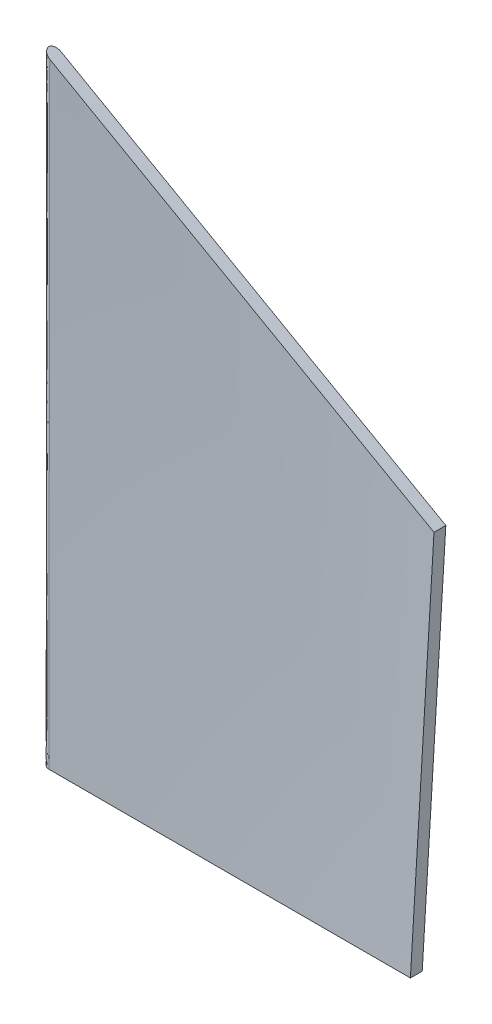
ISO-10303-21;
HEADER;
FILE_DESCRIPTION(('STEP AP214'),'2;1');
FILE_NAME('part.step','',(''),(''),'','','');
FILE_SCHEMA(('AUTOMOTIVE_DESIGN { 1 0 10303 214 1 1 1 1 }'));
ENDSEC;
DATA;
#1=APPLICATION_CONTEXT('core data for automotive mechanical design processes');
#2=APPLICATION_PROTOCOL_DEFINITION('international standard','automotive_design',2000,#1);
#3=PRODUCT_CONTEXT('',#1,'mechanical');
#4=PRODUCT('Part','Part','',(#3));
#5=PRODUCT_RELATED_PRODUCT_CATEGORY('part','',(#4));
#6=PRODUCT_DEFINITION_FORMATION('','',#4);
#7=PRODUCT_DEFINITION_CONTEXT('part definition',#1,'design');
#8=PRODUCT_DEFINITION('design','',#6,#7);
#9=PRODUCT_DEFINITION_SHAPE('','',#8);
#10=(LENGTH_UNIT() NAMED_UNIT(*) SI_UNIT(.MILLI.,.METRE.));
#11=(NAMED_UNIT(*) PLANE_ANGLE_UNIT() SI_UNIT($,.RADIAN.));
#12=(NAMED_UNIT(*) SI_UNIT($,.STERADIAN.) SOLID_ANGLE_UNIT());
#13=UNCERTAINTY_MEASURE_WITH_UNIT(LENGTH_MEASURE(1.E-05),#10,'distance_accuracy_value','');
#14=(GEOMETRIC_REPRESENTATION_CONTEXT(3) GLOBAL_UNCERTAINTY_ASSIGNED_CONTEXT((#13)) GLOBAL_UNIT_ASSIGNED_CONTEXT((#10,
#11,#12)) REPRESENTATION_CONTEXT('',''));
#15=CARTESIAN_POINT('',(0.,0.,0.));
#16=DIRECTION('',(0.,0.,1.));
#17=DIRECTION('',(1.,0.,0.));
#18=AXIS2_PLACEMENT_3D('',#15,#16,#17);
#19=CARTESIAN_POINT('',(1400.,0.,0.));
#20=DIRECTION('',(1.,0.,0.));
#21=DIRECTION('',(0.,0.,-1.));
#22=AXIS2_PLACEMENT_3D('',#19,#20,#21);
#23=PLANE('',#22);
#24=DIRECTION('',(0.,-0.998015754214462,0.0629647070964179));
#25=VECTOR('',#24,1.);
#26=CARTESIAN_POINT('',(1400.,92.4657383773244,-401.744638672518));
#27=LINE('',#26,#25);
#28=CARTESIAN_POINT('',(1400.,92.4657383773244,-401.744638672518));
#29=VERTEX_POINT('',#28);
#30=CARTESIAN_POINT('',(1400.,-1330.77458823529,-311.952558823529));
#31=VERTEX_POINT('',#30);
#32=EDGE_CURVE('E104',#29,#31,#27,.T.);
#33=ORIENTED_EDGE('',*,*,#32,.T.);
#34=DIRECTION('',(0.,0.,-1.));
#35=VECTOR('',#34,1.);
#36=CARTESIAN_POINT('',(1400.,-1330.77458823529,-311.952558823529));
#37=LINE('',#36,#35);
#38=CARTESIAN_POINT('',(1400.,-1330.77458823529,-356.952558823529));
#39=VERTEX_POINT('',#38);
#40=EDGE_CURVE('E111',#31,#39,#37,.T.);
#41=ORIENTED_EDGE('',*,*,#40,.T.);
#42=DIRECTION('',(0.,0.998015754214462,-0.0629647070964177));
#43=VECTOR('',#42,1.);
#44=CARTESIAN_POINT('',(1400.,-1330.77458823529,-356.952558823529));
#45=LINE('',#44,#43);
#46=CARTESIAN_POINT('',(1400.,92.4657383773244,-446.744638672517));
#47=VERTEX_POINT('',#46);
#48=EDGE_CURVE('E121',#39,#47,#45,.T.);
#49=ORIENTED_EDGE('',*,*,#48,.T.);
#50=DIRECTION('',(0.,0.,1.));
#51=VECTOR('',#50,1.);
#52=CARTESIAN_POINT('',(1400.,92.4657383773244,-446.744638672517));
#53=LINE('',#52,#51);
#54=EDGE_CURVE('E126',#47,#29,#53,.T.);
#55=ORIENTED_EDGE('',*,*,#54,.T.);
#56=EDGE_LOOP('',(#33,#41,#49,#55));
#57=FACE_BOUND('',#56,.T.);
#58=ADVANCED_FACE('F50',(#57),#23,.T.);
#59=CARTESIAN_POINT('',(473.449888531999,710.170008673457,0.));
#60=DIRECTION('',(-0.554702804854113,-0.832048555246015,0.));
#61=DIRECTION('',(0.832048555246015,-0.554702804854113,0.));
#62=AXIS2_PLACEMENT_3D('',#59,#60,#61);
#63=PLANE('',#62);
#64=CARTESIAN_POINT('',(23.0297823727022,1536.18717366793,-358.76130764199));
#65=CARTESIAN_POINT('',(0.,1536.18832227945,-356.940698138239));
#66=CARTESIAN_POINT('',(0.,1536.20289695762,-333.839068671961));
#67=CARTESIAN_POINT('',(23.0895874455431,1448.52472372273,-358.710730605591));
#68=CARTESIAN_POINT('',(0.,1448.42704420805,-356.940999121895));
#69=CARTESIAN_POINT('',(0.,1448.54049109649,-333.783763269645));
#70=CARTESIAN_POINT('',(23.1494451110105,1360.86227399166,-358.659723070246));
#71=CARTESIAN_POINT('',(0.,1360.76470495197,-356.941305187753));
#72=CARTESIAN_POINT('',(0.,1360.8780853735,-333.728240612554));
#73=CARTESIAN_POINT('',(23.2692656271985,1185.5373749578,-358.556847001661));
#74=CARTESIAN_POINT('',(0.,1185.44102907016,-356.941928219755));
#75=CARTESIAN_POINT('',(0.,1185.5532742038,-333.616760788822));
#76=CARTESIAN_POINT('',(23.3292284779191,1097.874925655,-358.504978468421));
#77=CARTESIAN_POINT('',(0.,1097.77869068505,-356.942245213898));
#78=CARTESIAN_POINT('',(0.,1097.89086875709,-333.560803622181));
#79=CARTESIAN_POINT('',(23.3892439212662,1010.21247656634,-358.452679436235));
#80=CARTESIAN_POINT('',(0.,1010.21344425655,-356.942567357904));
#81=CARTESIAN_POINT('',(0.,1010.22846344853,-333.504629200765));
#82=CARTESIAN_POINT('',(23.4618940059576,904.089587032328,-358.389366087303));
#83=CARTESIAN_POINT('',(0.,903.945306395406,-356.942958354512));
#84=CARTESIAN_POINT('',(0.,904.105626908464,-333.436625049781));
#85=CARTESIAN_POINT('',(23.5346146441449,797.966697823857,-358.325419178989));
#86=CARTESIAN_POINT('',(0.,797.821384480601,-356.943356988395));
#87=CARTESIAN_POINT('',(0.,797.98279057239,-333.368301814623));
#88=CARTESIAN_POINT('',(23.8004246981863,410.39602295246,-358.089558317901));
#89=CARTESIAN_POINT('',(0.,409.363990813433,-356.944846404035));
#90=CARTESIAN_POINT('',(0.,410.412308307109,-333.117611816514));
#91=CARTESIAN_POINT('',(23.9938899815547,128.948239342311,-357.913810194549));
#92=CARTESIAN_POINT('',(0.,127.896520984426,-356.945984320373));
#93=CARTESIAN_POINT('',(0.,128.964663623125,-332.933316764469));
#94=CARTESIAN_POINT('',(24.3813887988173,-433.947322508444,-357.553303386085));
#95=CARTESIAN_POINT('',(0.,-435.007159361359,-356.948381215767));
#96=CARTESIAN_POINT('',(0.,-433.930622716674,-332.560211956218));
#97=CARTESIAN_POINT('',(24.5754223327115,-715.395100749048,-357.368544700975));
#98=CARTESIAN_POINT('',(0.,-716.473353873393,-356.949641239107));
#99=CARTESIAN_POINT('',(0.,-715.37826437249,-332.371402200014));
#100=CARTESIAN_POINT('',(24.8463719484781,-1108.15344724585,-357.104402407032));
#101=CARTESIAN_POINT('',(0.,-1108.32308891112,-356.951483175768));
#102=CARTESIAN_POINT('',(0.,-1108.13642221495,-332.10476214926));
#103=CARTESIAN_POINT('',(24.9231809028819,-1219.46401797778,-357.028834978048));
#104=CARTESIAN_POINT('',(0.,-1219.63491319631,-356.952016377083));
#105=CARTESIAN_POINT('',(0.,-1219.4469396993,-332.02884052193));
#106=CARTESIAN_POINT('',(24.9999999999949,-1330.7745882341,-356.95255882353));
#107=CARTESIAN_POINT('',(0.,-1330.77458823409,-356.952558804296));
#108=CARTESIAN_POINT('',(0.,-1330.75745694043,-331.952564673926));
#109=CARTESIAN_POINT('',(25.0587115356161,-1415.84318958375,-356.894265465143));
#110=CARTESIAN_POINT('',(0.,-1415.94432005971,-356.952974492712));
#111=CARTESIAN_POINT('',(0.,-1415.82601776931,-331.894271316087));
#112=CARTESIAN_POINT('',(25.1174245919387,-1500.91179064895,-356.835558387637));
#113=CARTESIAN_POINT('',(0.,-1501.01290026615,-356.953395590913));
#114=CARTESIAN_POINT('',(0.,-1500.89457845544,-331.835771108754));
#115=CARTESIAN_POINT('',(25.234853745987,-1671.04899221046,-356.717316794386));
#116=CARTESIAN_POINT('',(0.,-1671.14933610689,-356.954249660633));
#117=CARTESIAN_POINT('',(0.,-1671.03169954221,-331.718356995096));
#118=CARTESIAN_POINT('',(25.2935698437126,-1756.11759270678,-356.65778227864));
#119=CARTESIAN_POINT('',(0.,-1756.21791603396,-356.954682663946));
#120=CARTESIAN_POINT('',(0.,-1756.10025994284,-331.659443088772));
#121=CARTESIAN_POINT('',(25.3522874621398,-1841.18619291865,-356.597834043776));
#122=CARTESIAN_POINT('',(0.,-1841.18644122529,-356.95512115295));
#123=CARTESIAN_POINT('',(0.,-1841.16882020072,-331.600322332953));
#124=(BOUNDED_SURFACE() B_SPLINE_SURFACE(3,2,((#64,#65,#66),(#67,#68,#69),(#70,#71,#72),(#73,
#74,#75),(#76,#77,#78),(#79,#80,#81),(#82,#83,#84),(#85,#86,#87),(#88,#89,#90),(#91,#92,#93),
(#94,#95,#96),(#97,#98,#99),(#100,#101,#102),(#103,#104,#105),(#106,#107,#108),(#109,#110,#111),
(#112,#113,#114),(#115,#116,#117),(#118,#119,#120),(#121,#122,#123)),.UNSPECIFIED.,.F.,.F.,
.F.) B_SPLINE_SURFACE_WITH_KNOTS((4,2,3,2,2,2,3,2,4),(3,3),(0.,262.987269918461,
525.974539836925,844.343114824129,1688.68622985534,2533.0293447793,2866.96097490581,
3122.1667173086,3377.3724597114),(0.,1.),
.UNSPECIFIED.) GEOMETRIC_REPRESENTATION_ITEM() RATIONAL_B_SPLINE_SURFACE(((1.,0.734441524252242,
1.),(1.,0.73362724503524,1.),(1.,0.732810874601512,1.),(1.,0.731173951300601,1.),(1.,
0.730353398433418,1.),(1.,0.729530754349508,1.),(1.,0.728534908765118,1.),(1.,0.727536055173603,
1.),(1.,0.723877449833497,1.),(1.,0.721200022362591,1.),(1.,0.715806883948274,1.),(1.,
0.713091173004869,1.),(1.,0.709276907001868,1.),(1.,0.708193168964025,1.),(1.,0.707106781186619,
1.),(1.,0.706276485282414,1.),(1.,0.705444689569181,1.),(1.,0.703778098524658,1.),(1.,
0.702943303193368,1.),(1.,0.702107008053049,1.))) REPRESENTATION_ITEM('') SURFACE());
#125=CARTESIAN_POINT('',(23.3892439229176,1010.212476562,-358.452679436339));
#126=CARTESIAN_POINT('',(22.5072693174822,1010.80046362641,-358.396078232807));
#127=CARTESIAN_POINT('',(21.6272419685426,1011.387152511,-358.292698751255));
#128=CARTESIAN_POINT('',(19.87753091301,1012.55363447178,-357.99182845185));
#129=CARTESIAN_POINT('',(19.007858261349,1013.13342017796,-357.794244936516));
#130=CARTESIAN_POINT('',(17.2825993267524,1014.28360061405,-357.303248274501));
#131=CARTESIAN_POINT('',(16.4271098241057,1014.85393082333,-357.00934209468));
#132=CARTESIAN_POINT('',(14.7434056252257,1015.97640791409,-356.325580737037));
#133=CARTESIAN_POINT('',(13.9151771534785,1016.52856397931,-355.935774890035));
#134=CARTESIAN_POINT('',(12.4807257076199,1017.48487143929,-355.160418348145));
#135=CARTESIAN_POINT('',(11.8671557754228,1017.89392083937,-354.794400505274));
#136=CARTESIAN_POINT('',(10.6659644500225,1018.69472049603,-354.005227828057));
#137=CARTESIAN_POINT('',(10.0783416133156,1019.08647171495,-353.582076177539));
#138=CARTESIAN_POINT('',(8.93548913776802,1019.84837854085,-352.680045180309));
#139=CARTESIAN_POINT('',(8.38017924048014,1020.21858765382,-352.201313602824));
#140=CARTESIAN_POINT('',(7.5746578669244,1020.75560555075,-351.441625545205));
#141=CARTESIAN_POINT('',(7.31072859427861,1020.93155959441,-351.181468834649));
#142=CARTESIAN_POINT('',(6.7926104449698,1021.27697404031,-350.647332141541));
#143=CARTESIAN_POINT('',(6.53842410701141,1021.44643275006,-350.373348598654));
#144=CARTESIAN_POINT('',(5.87065766443801,1021.89161340249,-349.620083998967));
#145=CARTESIAN_POINT('',(5.46671832258407,1022.16090812635,-349.128333500944));
#146=CARTESIAN_POINT('',(4.69267650518617,1022.67693950995,-348.107910141977));
#147=CARTESIAN_POINT('',(4.32256821325746,1022.92368004731,-347.579243655467));
#148=CARTESIAN_POINT('',(3.61979761784577,1023.39219696016,-346.486473169185));
#149=CARTESIAN_POINT('',(3.28715901721452,1023.61395753363,-345.922347085724));
#150=CARTESIAN_POINT('',(2.66363973721448,1024.02963987731,-344.761634570871));
#151=CARTESIAN_POINT('',(2.37275816584711,1024.22356224218,-344.165048833248));
#152=CARTESIAN_POINT('',(1.83475011625896,1024.58223671167,-342.938424631421));
#153=CARTESIAN_POINT('',(1.58795535278908,1024.74676767162,-342.308175406354));
#154=CARTESIAN_POINT('',(1.14446307496923,1025.04243119857,-341.022508135973));
#155=CARTESIAN_POINT('',(0.947774078246159,1025.17355808711,-340.367085833176));
#156=CARTESIAN_POINT('',(0.608221753522993,1025.39992784129,-339.037998330067));
#157=CARTESIAN_POINT('',(0.465237990624556,1025.49525099741,-338.364377623627));
#158=CARTESIAN_POINT('',(0.235108283439945,1025.64867184437,-337.003855516435));
#159=CARTESIAN_POINT('',(0.147920699893635,1025.7067972949,-336.316964414353));
#160=CARTESIAN_POINT('',(0.0596134120703507,1025.76566922003,-335.275688865847));
#161=CARTESIAN_POINT('',(0.037253524720883,1025.78057591285,-334.923740239924));
#162=CARTESIAN_POINT('',(0.00745464846285257,1025.8004419653,-334.219416541543));
#163=CARTESIAN_POINT('',(-4.78016436382598E-06,1025.8054149515,-333.867042717641));
#164=CARTESIAN_POINT('',(0.,1025.80541176471,-333.51460875142));
#165=B_SPLINE_CURVE_WITH_KNOTS('',3,(#125,#126,#127,#128,#129,#130,#131,#132,#133,#134,#135,
#136,#137,#138,#139,#140,#141,#142,#143,#144,#145,#146,#147,#148,#149,#150,#151,#152,#153,#154,
#155,#156,#157,#158,#159,#160,#161,#162,#163,#164),.UNSPECIFIED.,.F.,.F.,(4,2,2,2,2,2,2,2,2,2,2,
2,2,2,2,2,2,2,2,4),(0.,3.1837583944968,6.3706561174985,9.57412780597415,12.775955060495,
15.2433619937321,17.7106314853596,20.1714853645524,21.4018735570924,22.6325802006112,
24.7034109096602,26.7738849199985,28.845661416594,30.9173936500608,33.0041114276086,
35.0911836961036,37.1735473227612,39.254355116967,40.3128770711899,41.3699459970123),.UNSPECIFIED.);
#166=CARTESIAN_POINT('',(23.3892439229176,1010.212476562,-358.452679436339));
#167=VERTEX_POINT('',#166);
#168=CARTESIAN_POINT('',(0.130682019118784,1025.71828982682,-336.067399563588));
#169=VERTEX_POINT('',#168);
#170=EDGE_CURVE('E68',#167,#169,#165,.T.);
#171=ORIENTED_EDGE('',*,*,#170,.T.);
#172=CARTESIAN_POINT('',(24.6477330695893,-1841.36137854323,-311.607642923373));
#173=CARTESIAN_POINT('',(0.,-1841.3616131797,-311.954980578097));
#174=CARTESIAN_POINT('',(0.,-1841.37826507385,-336.605155256699));
#175=CARTESIAN_POINT('',(24.7064236986728,-1756.26357961836,-311.664301647961));
#176=CARTESIAN_POINT('',(0.,-1756.16401979985,-311.954588107471));
#177=CARTESIAN_POINT('',(0.,-1756.28050720193,-336.662641142633));
#178=CARTESIAN_POINT('',(24.7651245907483,-1671.16578096379,-311.721374001934));
#179=CARTESIAN_POINT('',(0.,-1671.06625731832,-311.95419031792));
#180=CARTESIAN_POINT('',(0.,-1671.18274947076,-336.720333895143));
#181=CARTESIAN_POINT('',(24.8825469008832,-1500.97018419527,-311.836345968653));
#182=CARTESIAN_POINT('',(0.,-1500.8714963017,-311.953383117264));
#183=CARTESIAN_POINT('',(0.,-1500.98723428992,-336.836133133314));
#184=CARTESIAN_POINT('',(24.9412683189427,-1415.87238608131,-311.894245581397));
#185=CARTESIAN_POINT('',(0.,-1415.77373419849,-311.952973675366));
#186=CARTESIAN_POINT('',(0.,-1415.88947684025,-336.894239618976));
#187=CARTESIAN_POINT('',(24.9999999999941,-1330.77458823765,-311.952558823527));
#188=CARTESIAN_POINT('',(0.,-1330.77458823766,-311.952558840844));
#189=CARTESIAN_POINT('',(0.,-1330.79171953133,-336.952552971213));
#190=CARTESIAN_POINT('',(25.0768024512539,-1219.48807577971,-312.028817741743));
#191=CARTESIAN_POINT('',(0.,-1219.31661291463,-311.952014859578));
#192=CARTESIAN_POINT('',(0.,-1219.50526007742,-337.028812126707));
#193=CARTESIAN_POINT('',(25.1536149969124,-1108.20156379626,-312.105785083534));
#194=CARTESIAN_POINT('',(0.,-1108.02906366648,-311.95146158533));
#195=CARTESIAN_POINT('',(0.,-1108.21880086565,-337.105425350007));
#196=CARTESIAN_POINT('',(25.4247141063769,-715.432946537461,-312.379928647899));
#197=CARTESIAN_POINT('',(0.,-714.324631002632,-311.949468192895));
#198=CARTESIAN_POINT('',(0.,-715.450368989128,-337.377069404367));
#199=CARTESIAN_POINT('',(25.6190022755008,-433.950843908004,-312.580926974739));
#200=CARTESIAN_POINT('',(0.,-432.825274083512,-311.947976979126));
#201=CARTESIAN_POINT('',(0.,-433.968397644037,-337.574011110833));
#202=CARTESIAN_POINT('',(26.0072653549704,129.013354534284,-312.991974007519));
#203=CARTESIAN_POINT('',(0.,130.148276890071,-311.944860461015));
#204=CARTESIAN_POINT('',(0.,128.995541804966,-337.972422894489));
#205=CARTESIAN_POINT('',(26.2012402653161,410.495450347114,-313.202022713458));
#206=CARTESIAN_POINT('',(0.,411.646028368779,-311.943233940152));
#207=CARTESIAN_POINT('',(0.,410.477509908879,-338.173892971678));
#208=CARTESIAN_POINT('',(26.4673907243386,797.339630477978,-313.496883124504));
#209=CARTESIAN_POINT('',(0.,797.502891520308,-311.940909881841));
#210=CARTESIAN_POINT('',(0.,797.321517265461,-338.45388042092));
#211=CARTESIAN_POINT('',(26.5398362965541,902.701717916964,-313.577823083057));
#212=CARTESIAN_POINT('',(0.,902.86591945015,-311.940265496112));
#213=CARTESIAN_POINT('',(0.,902.683557926199,-338.530455199659));
#214=CARTESIAN_POINT('',(26.6122296171817,1008.06380483487,-313.65939271406));
#215=CARTESIAN_POINT('',(0.,1008.06505989357,-311.939612311786));
#216=CARTESIAN_POINT('',(0.,1008.04559835567,-338.607346236013));
#217=CARTESIAN_POINT('',(26.672738035913,1096.12380609869,-313.727567842205));
#218=CARTESIAN_POINT('',(0.,1096.24004643464,-311.939064804064));
#219=CARTESIAN_POINT('',(0.,1096.10556076104,-338.671610672156));
#220=CARTESIAN_POINT('',(26.7332052587051,1184.18380699237,-313.79618135536));
#221=CARTESIAN_POINT('',(0.,1184.30010472907,-311.938511153232));
#222=CARTESIAN_POINT('',(0.,1184.16552300434,-338.736095675436));
#223=CARTESIAN_POINT('',(26.8540573124109,1360.30380803949,-313.934285151691));
#224=CARTESIAN_POINT('',(0.,1360.41963863404,-311.937390052323));
#225=CARTESIAN_POINT('',(0.,1360.2854471668,-338.86550681627));
#226=CARTESIAN_POINT('',(26.9144421433245,1448.36380819292,-314.003775434866));
#227=CARTESIAN_POINT('',(0.,1448.47969718407,-311.9368225625));
#228=CARTESIAN_POINT('',(0.,1448.34540908596,-338.930432953824));
#229=CARTESIAN_POINT('',(26.9747857782988,1536.42380797623,-314.073704103052));
#230=CARTESIAN_POINT('',(0.,1536.4253892596,-311.936248835901));
#231=CARTESIAN_POINT('',(0.,1536.40537084304,-338.995579658514));
#232=(BOUNDED_SURFACE() B_SPLINE_SURFACE(3,2,((#172,#173,#174),(#175,#176,#177),(#178,#179,
#180),(#181,#182,#183),(#184,#185,#186),(#187,#188,#189),(#190,#191,#192),(#193,#194,#195),
(#196,#197,#198),(#199,#200,#201),(#202,#203,#204),(#205,#206,#207),(#208,#209,#210),(#211,#212,
#213),(#214,#215,#216),(#217,#218,#219),(#220,#221,#222),(#223,#224,#225),(#226,#227,#228),
(#229,#230,#231)),.UNSPECIFIED.,.F.,.F.,.F.) B_SPLINE_SURFACE_WITH_KNOTS((4,2,3,2,2,2,3,2,4),(3,
3),(0.,255.293331863445,510.586663726891,844.44612047438,1688.89224115928,2533.33836173486,
2849.42456719428,3113.60452475629,3377.7844823183),(0.,1.),
.UNSPECIFIED.) GEOMETRIC_REPRESENTATION_ITEM() RATIONAL_B_SPLINE_SURFACE(((1.,0.712071161196839,
1.),(1.,0.711246948072847,1.),(1.,0.710421143176667,1.),(1.,0.708766349839931,1.),(1.,
0.707937361399375,1.),(1.,0.707106781186631,1.),(1.,0.706020632352646,1.),(1.,0.704931835302445,
1.),(1.,0.70108011964514,1.),(1.,0.698303476662225,1.),(1.,0.692721071928184,1.),(1.,
0.689915310177061,1.),(1.,0.686041762517883,1.),(1.,0.68498496118046,1.),(1.,0.683926463646246,
1.),(1.,0.683041751286128,1.),(1.,0.682155911460305,1.),(1.,0.680381976877248,1.),(1.,
0.679493882120013,1.),(1.,0.678604659897074,1.))) REPRESENTATION_ITEM('') SURFACE());
#233=CARTESIAN_POINT('',(0.,1025.80541176471,-338.620309944312));
#234=CARTESIAN_POINT('',(-2.55149094135525E-06,1025.80541346571,-338.310548165975));
#235=CARTESIAN_POINT('',(0.00575848448294633,1025.80157274897,-338.000828842628));
#236=CARTESIAN_POINT('',(0.0287659172458221,1025.78623435627,-337.382020292351));
#237=CARTESIAN_POINT('',(0.0460118151255064,1025.77473701292,-337.072931038635));
#238=CARTESIAN_POINT('',(0.114885388675678,1025.72882098532,-336.147781294721));
#239=CARTESIAN_POINT('',(0.183649056973597,1025.68297822838,-335.533440280288));
#240=CARTESIAN_POINT('',(0.365383749673495,1025.56182094358,-334.317603940811));
#241=CARTESIAN_POINT('',(0.478129487388771,1025.48665660785,-333.71605937001));
#242=CARTESIAN_POINT('',(0.746234550017455,1025.30791868529,-332.52681043869));
#243=CARTESIAN_POINT('',(0.90159644440915,1025.20434338545,-331.939106915018));
#244=CARTESIAN_POINT('',(1.2525721994294,1024.97035795934,-330.782319435504));
#245=CARTESIAN_POINT('',(1.44812980376428,1024.83998533751,-330.213210731508));
#246=CARTESIAN_POINT('',(1.87723067294129,1024.55391614817,-329.095977590068));
#247=CARTESIAN_POINT('',(2.1107772012602,1024.39821740498,-328.547854960455));
#248=CARTESIAN_POINT('',(2.48760761558701,1024.14699542224,-327.743432498897));
#249=CARTESIAN_POINT('',(2.6177242266858,1024.0602504256,-327.478094499932));
#250=CARTESIAN_POINT('',(2.88640174161327,1023.88113086558,-326.953762334764));
#251=CARTESIAN_POINT('',(3.02496039429771,1023.78875780297,-326.694766502967));
#252=CARTESIAN_POINT('',(3.45285800181016,1023.50349079352,-325.927549891694));
#253=CARTESIAN_POINT('',(3.75442410085478,1023.30244536181,-325.429088306835));
#254=CARTESIAN_POINT('',(4.40687254149198,1022.86747678004,-324.430112187163));
#255=CARTESIAN_POINT('',(4.75965537433932,1022.63228662719,-323.931397066258));
#256=CARTESIAN_POINT('',(5.49534731182027,1022.14182200387,-322.967196756679));
#257=CARTESIAN_POINT('',(5.87825738798865,1021.88654688571,-322.501712640554));
#258=CARTESIAN_POINT('',(6.67101432382694,1021.35803867173,-321.605114002859));
#259=CARTESIAN_POINT('',(7.08086389779907,1021.08480376637,-321.174002954278));
#260=CARTESIAN_POINT('',(7.92445999203202,1020.5224025499,-320.34694435153));
#261=CARTESIAN_POINT('',(8.35820958962873,1020.23323418721,-319.951001342778));
#262=CARTESIAN_POINT('',(9.31782308018536,1019.59348751446,-319.134316957933));
#263=CARTESIAN_POINT('',(9.84732327471041,1019.24048498688,-318.719739608811));
#264=CARTESIAN_POINT('',(10.9304930592428,1018.51836689194,-317.939042848914));
#265=CARTESIAN_POINT('',(11.4841649469349,1018.14924979278,-317.572928058232));
#266=CARTESIAN_POINT('',(12.6123180897396,1017.39714258861,-316.889051974855));
#267=CARTESIAN_POINT('',(13.1868151276245,1017.01414196168,-316.571328346748));
#268=CARTESIAN_POINT('',(14.3527639658125,1016.23683745609,-315.98452669647));
#269=CARTESIAN_POINT('',(14.9442172371066,1015.84253259677,-315.715452909667));
#270=CARTESIAN_POINT('',(16.2405180574881,1014.97832617941,-315.185066559126));
#271=CARTESIAN_POINT('',(16.9478513439373,1014.50676745187,-314.932503232715));
#272=CARTESIAN_POINT('',(18.3766202249294,1013.55424839421,-314.493121099004));
#273=CARTESIAN_POINT('',(19.0980588133664,1013.07328606813,-314.306316412652));
#274=CARTESIAN_POINT('',(20.5498282012131,1012.10543323507,-313.998395301311));
#275=CARTESIAN_POINT('',(21.2801498057805,1011.61854885802,-313.87721602944));
#276=CARTESIAN_POINT('',(22.745984614073,1010.6413190143,-313.700118613852));
#277=CARTESIAN_POINT('',(23.4814954461309,1010.15097512875,-313.644172382755));
#278=CARTESIAN_POINT('',(24.6170306581473,1009.39394651168,-313.608061831064));
#279=CARTESIAN_POINT('',(25.0166385809426,1009.12753942014,-313.604940499798));
#280=CARTESIAN_POINT('',(25.8150362224213,1008.59527071019,-313.617846693523));
#281=CARTESIAN_POINT('',(26.2138262649847,1008.32940887585,-313.633845288122));
#282=CARTESIAN_POINT('',(26.6122296162262,1008.06380483748,-313.659392714));
#283=B_SPLINE_CURVE_WITH_KNOTS('',3,(#233,#234,#235,#236,#237,#238,#239,#240,#241,#242,#243,
#244,#245,#246,#247,#248,#249,#250,#251,#252,#253,#254,#255,#256,#257,#258,#259,#260,#261,#262,
#263,#264,#265,#266,#267,#268,#269,#270,#271,#272,#273,#274,#275,#276,#277,#278,#279,#280,#281,
#282),.UNSPECIFIED.,.F.,.F.,(4,2,2,2,2,2,2,2,2,2,2,2,2,2,2,2,2,2,2,2,2,2,2,2,4),(0.,
0.929123760668196,1.85820716227443,3.71518263591392,5.56276856005125,7.410465906151,
9.25559468562683,11.1008820565434,12.0246606551386,12.948193989153,14.7952204881603,
16.7570901082996,18.7190230202031,20.6811539115238,22.6435380373253,24.9198193531538,
27.1963175182317,29.4745786072135,31.7530379421016,34.4108060604506,37.0691445577513,
39.7249327464788,42.379577010182,43.8200795475892,45.2584052149669),.UNSPECIFIED.);
#284=CARTESIAN_POINT('',(26.6122296162265,1008.06380483748,-313.659392714));
#285=VERTEX_POINT('',#284);
#286=EDGE_CURVE('E58',#169,#285,#283,.T.);
#287=ORIENTED_EDGE('',*,*,#286,.T.);
#288=DIRECTION('',(0.830866304458809,-0.55391463230869,-0.0532894382527141));
#289=VECTOR('',#288,1.);
#290=CARTESIAN_POINT('',(0.,1025.80541176471,-311.952558823529));
#291=LINE('',#290,#289);
#292=EDGE_CURVE('E193',#285,#29,#291,.T.);
#293=ORIENTED_EDGE('',*,*,#292,.T.);
#294=ORIENTED_EDGE('',*,*,#54,.F.);
#295=DIRECTION('',(0.830866304458809,-0.55391463230869,-0.0532894382527138));
#296=VECTOR('',#295,1.);
#297=CARTESIAN_POINT('',(0.,1025.80541176471,-356.952558823529));
#298=LINE('',#297,#296);
#299=EDGE_CURVE('E112',#167,#47,#298,.T.);
#300=ORIENTED_EDGE('',*,*,#299,.F.);
#301=EDGE_LOOP('',(#171,#287,#293,#294,#300));
#302=FACE_BOUND('',#301,.T.);
#303=ADVANCED_FACE('F146',(#302),#63,.F.);
#304=CARTESIAN_POINT('',(0.,-1330.77458823529,-356.952558823529));
#305=CARTESIAN_POINT('',(1400.,-1330.77458823529,-356.952558823529));
#306=CARTESIAN_POINT('',(0.,-938.011254901958,-356.952558823529));
#307=CARTESIAN_POINT('',(1400.,-1093.56786713319,-371.917905465027));
#308=CARTESIAN_POINT('',(0.,-545.247921568624,-356.952558823529));
#309=CARTESIAN_POINT('',(1400.,-856.361146031091,-386.883252106525));
#310=CARTESIAN_POINT('',(0.,240.278745098043,-356.952558823529));
#311=CARTESIAN_POINT('',(1400.,-381.947703826885,-416.813945389521));
#312=CARTESIAN_POINT('',(0.,633.042078431375,-356.952558823529));
#313=CARTESIAN_POINT('',(1400.,-144.740982724781,-431.779292031019));
#314=CARTESIAN_POINT('',(0.,1025.80541176471,-356.952558823529));
#315=CARTESIAN_POINT('',(1400.,92.4657383773237,-446.744638672517));
#316=B_SPLINE_SURFACE_WITH_KNOTS('',3,1,((#304,#305),(#306,#307),(#308,#309),(#310,#311),(#312,
#313),(#314,#315)),.UNSPECIFIED.,.F.,.F.,.F.,(4,2,4),(2,2),(0.,0.5,1.),(0.,1.),.UNSPECIFIED.);
#317=DIRECTION('',(1.,0.,0.));
#318=VECTOR('',#317,1.);
#319=CARTESIAN_POINT('',(0.,-1330.77458823529,-356.952558823529));
#320=LINE('',#319,#318);
#321=CARTESIAN_POINT('',(25.,-1330.77458823529,-356.952558823529));
#322=VERTEX_POINT('',#321);
#323=EDGE_CURVE('E109',#322,#39,#320,.T.);
#324=CARTESIAN_POINT('',(25.3522874621398,-1841.18619291865,-356.597834043776));
#325=CARTESIAN_POINT('',(25.2935698437126,-1756.11759270678,-356.65778227864));
#326=CARTESIAN_POINT('',(25.234853745987,-1671.04899221046,-356.717316794386));
#327=CARTESIAN_POINT('',(25.1174245919387,-1500.91179064895,-356.835558387637));
#328=CARTESIAN_POINT('',(25.0587115356161,-1415.84318958375,-356.894265465143));
#329=CARTESIAN_POINT('',(24.9999999999949,-1330.7745882341,-356.95255882353));
#330=CARTESIAN_POINT('',(24.9231809028819,-1219.46401797778,-357.028834978048));
#331=CARTESIAN_POINT('',(24.8463719484781,-1108.15344724585,-357.104402407032));
#332=CARTESIAN_POINT('',(24.5754223327115,-715.395100749048,-357.368544700975));
#333=CARTESIAN_POINT('',(24.3813887988173,-433.947322508444,-357.553303386085));
#334=CARTESIAN_POINT('',(23.9938899815547,128.948239342311,-357.913810194549));
#335=CARTESIAN_POINT('',(23.8004246981863,410.39602295246,-358.089558317901));
#336=CARTESIAN_POINT('',(23.5346146441449,797.966697823857,-358.325419178989));
#337=CARTESIAN_POINT('',(23.4618940059576,904.089587032329,-358.389366087303));
#338=CARTESIAN_POINT('',(23.3892439212662,1010.21247656634,-358.452679436235));
#339=CARTESIAN_POINT('',(23.3292284779191,1097.874925655,-358.504978468421));
#340=CARTESIAN_POINT('',(23.2692656271985,1185.5373749578,-358.556847001661));
#341=CARTESIAN_POINT('',(23.1494451110105,1360.86227399166,-358.659723070246));
#342=CARTESIAN_POINT('',(23.0895874455431,1448.52472372273,-358.710730605591));
#343=CARTESIAN_POINT('',(23.0297823727022,1536.18717366793,-358.76130764199));
#344=B_SPLINE_CURVE_WITH_KNOTS('',3,(#324,#325,#326,#327,#328,#329,#330,#331,#332,#333,#334,
#335,#336,#337,#338,#339,#340,#341,#342,#343),.UNSPECIFIED.,.F.,.F.,(4,2,3,2,2,2,3,2,4),(0.,
255.205742402793,510.411484805585,844.343114932099,1688.68622985606,2533.02934488727,
2851.39791987447,3114.38518979293,3377.3724597114),.UNSPECIFIED.);
#345=EDGE_CURVE('E12',#322,#167,#344,.T.);
#346=ORIENTED_EDGE('',*,*,#323,.F.);
#347=ORIENTED_EDGE('',*,*,#345,.T.);
#348=ORIENTED_EDGE('',*,*,#299,.T.);
#349=ORIENTED_EDGE('',*,*,#48,.F.);
#350=EDGE_LOOP('',(#346,#347,#348,#349));
#351=FACE_BOUND('',#350,.T.);
#352=ADVANCED_FACE('F183',(#351),#316,.T.);
#353=CARTESIAN_POINT('',(0.,1025.80541176471,-311.952558823529));
#354=CARTESIAN_POINT('',(1400.,92.4657383773244,-401.744638672518));
#355=CARTESIAN_POINT('',(0.,633.042078431373,-311.952558823529));
#356=CARTESIAN_POINT('',(1400.,-144.740982724777,-386.77929203102));
#357=CARTESIAN_POINT('',(0.,240.27874509804,-311.952558823529));
#358=CARTESIAN_POINT('',(1400.,-381.947703826879,-371.813945389522));
#359=CARTESIAN_POINT('',(0.,-545.247921568626,-311.952558823529));
#360=CARTESIAN_POINT('',(1400.,-856.361146031085,-341.883252106525));
#361=CARTESIAN_POINT('',(0.,-938.01125490196,-311.952558823529));
#362=CARTESIAN_POINT('',(1400.,-1093.56786713319,-326.917905465027));
#363=CARTESIAN_POINT('',(0.,-1330.77458823529,-311.952558823529));
#364=CARTESIAN_POINT('',(1400.,-1330.77458823529,-311.952558823529));
#365=B_SPLINE_SURFACE_WITH_KNOTS('',3,1,((#353,#354),(#355,#356),(#357,#358),(#359,#360),(#361,
#362),(#363,#364)),.UNSPECIFIED.,.F.,.F.,.F.,(4,2,4),(2,2),(0.,0.5,1.),(0.,1.),.UNSPECIFIED.);
#366=CARTESIAN_POINT('',(26.9747857782988,1536.42380797623,-314.073704103052));
#367=CARTESIAN_POINT('',(26.9144421433245,1448.36380819292,-314.003775434866));
#368=CARTESIAN_POINT('',(26.8540573124109,1360.30380803949,-313.934285151691));
#369=CARTESIAN_POINT('',(26.7332052587051,1184.18380699237,-313.79618135536));
#370=CARTESIAN_POINT('',(26.672738035913,1096.12380609869,-313.727567842205));
#371=CARTESIAN_POINT('',(26.6122296171817,1008.06380483487,-313.65939271406));
#372=CARTESIAN_POINT('',(26.5398362965541,902.701717916964,-313.577823083057));
#373=CARTESIAN_POINT('',(26.4673907243386,797.339630477978,-313.496883124504));
#374=CARTESIAN_POINT('',(26.2012402653161,410.495450347114,-313.202022713458));
#375=CARTESIAN_POINT('',(26.0072653549704,129.013354534284,-312.991974007519));
#376=CARTESIAN_POINT('',(25.6190022755008,-433.950843908004,-312.580926974739));
#377=CARTESIAN_POINT('',(25.4247141063769,-715.432946537461,-312.379928647899));
#378=CARTESIAN_POINT('',(25.1536149969124,-1108.20156379626,-312.105785083534));
#379=CARTESIAN_POINT('',(25.0768024512539,-1219.48807577971,-312.028817741743));
#380=CARTESIAN_POINT('',(24.9999999999941,-1330.77458823765,-311.952558823527));
#381=CARTESIAN_POINT('',(24.9412683189427,-1415.87238608131,-311.894245581397));
#382=CARTESIAN_POINT('',(24.8825469008832,-1500.97018419527,-311.836345968653));
#383=CARTESIAN_POINT('',(24.7651245907483,-1671.16578096379,-311.721374001934));
#384=CARTESIAN_POINT('',(24.7064236986728,-1756.26357961836,-311.664301647961));
#385=CARTESIAN_POINT('',(24.6477330695893,-1841.36137854323,-311.607642923373));
#386=B_SPLINE_CURVE_WITH_KNOTS('',3,(#366,#367,#368,#369,#370,#371,#372,#373,#374,#375,#376,
#377,#378,#379,#380,#381,#382,#383,#384,#385),.UNSPECIFIED.,.F.,.F.,(4,2,3,2,2,2,3,2,4),(0.,
264.179957562006,528.359915124015,844.44612058344,1688.89224115902,2533.33836184392,
2867.19781859141,3122.49115045485,3377.7844823183),.UNSPECIFIED.);
#387=CARTESIAN_POINT('',(25.,-1330.77458823529,-311.952558823529));
#388=VERTEX_POINT('',#387);
#389=EDGE_CURVE('E107',#285,#388,#386,.T.);
#390=DIRECTION('',(1.,0.,0.));
#391=VECTOR('',#390,1.);
#392=CARTESIAN_POINT('',(700.,-1330.77458823529,-311.952558823529));
#393=LINE('',#392,#391);
#394=EDGE_CURVE('E99',#388,#31,#393,.T.);
#395=ORIENTED_EDGE('',*,*,#292,.F.);
#396=ORIENTED_EDGE('',*,*,#389,.T.);
#397=ORIENTED_EDGE('',*,*,#394,.T.);
#398=ORIENTED_EDGE('',*,*,#32,.F.);
#399=EDGE_LOOP('',(#395,#396,#397,#398));
#400=FACE_BOUND('',#399,.T.);
#401=ADVANCED_FACE('F103',(#400),#365,.T.);
#402=CARTESIAN_POINT('',(0.,-1330.77458823529,0.));
#403=DIRECTION('',(0.,1.,0.));
#404=DIRECTION('',(0.,0.,1.));
#405=AXIS2_PLACEMENT_3D('',#402,#403,#404);
#406=PLANE('',#405);
#407=CARTESIAN_POINT('',(10.,-1330.77458823529,-334.452558823529));
#408=DIRECTION('',(0.,-1.,0.));
#409=DIRECTION('',(0.,0.,-1.));
#410=AXIS2_PLACEMENT_3D('',#407,#408,#409);
#411=CIRCLE('',#410,4.99999999999982);
#412=CARTESIAN_POINT('',(10.,-1330.77458823529,-339.452558823529));
#413=VERTEX_POINT('',#412);
#414=EDGE_CURVE('E302',#413,#413,#411,.T.);
#415=ORIENTED_EDGE('',*,*,#414,.F.);
#416=EDGE_LOOP('',(#415));
#417=FACE_BOUND('',#416,.T.);
#418=ORIENTED_EDGE('',*,*,#394,.F.);
#419=CARTESIAN_POINT('',(25.,-1330.77458823529,-311.952558823529));
#420=CARTESIAN_POINT('',(24.6483971624787,-1330.77458823529,-311.952558407217));
#421=CARTESIAN_POINT('',(24.2968334437477,-1330.77458823529,-311.95997720099));
#422=CARTESIAN_POINT('',(23.5943398846112,-1330.77458823529,-311.989631785205));
#423=CARTESIAN_POINT('',(23.2434100292937,-1330.77458823529,-312.011867222403));
#424=CARTESIAN_POINT('',(22.1925606548666,-1330.77458823529,-312.100751575486));
#425=CARTESIAN_POINT('',(21.494398976746,-1330.77458823529,-312.189578556592));
#426=CARTESIAN_POINT('',(20.1085733769323,-1330.77458823529,-312.425683063757));
#427=CARTESIAN_POINT('',(19.4209019239882,-1330.77458823529,-312.572916387836));
#428=CARTESIAN_POINT('',(18.4007189802222,-1330.77458823529,-312.836735192259));
#429=CARTESIAN_POINT('',(18.0625317730161,-1330.77458823529,-312.931841031547));
#430=CARTESIAN_POINT('',(17.3903774925865,-1330.77458823529,-313.136239716524));
#431=CARTESIAN_POINT('',(17.0564115231392,-1330.77458823529,-313.245536191905));
#432=CARTESIAN_POINT('',(16.0616711996362,-1330.77458823529,-313.594475932449));
#433=CARTESIAN_POINT('',(15.4081478808623,-1330.77458823529,-313.855145335351));
#434=CARTESIAN_POINT('',(14.1253951052286,-1330.77458823529,-314.430633865177));
#435=CARTESIAN_POINT('',(13.4961656516605,-1330.77458823529,-314.745452999437));
#436=CARTESIAN_POINT('',(12.5740320220386,-1330.77458823529,-315.256501717717));
#437=CARTESIAN_POINT('',(12.2702467159164,-1330.77458823529,-315.433338615344));
#438=CARTESIAN_POINT('',(11.6704773444886,-1330.77458823529,-315.799610259531));
#439=CARTESIAN_POINT('',(11.3744913008421,-1330.77458823529,-315.989041767573));
#440=CARTESIAN_POINT('',(10.4988638171422,-1330.77458823529,-316.575842699263));
#441=CARTESIAN_POINT('',(9.93149164197274,-1330.77458823529,-316.991752558717));
#442=CARTESIAN_POINT('',(8.83387853953986,-1330.77458823529,-317.869829141573));
#443=CARTESIAN_POINT('',(8.30363725459302,-1330.77458823529,-318.331995419279));
#444=CARTESIAN_POINT('',(7.28394625022453,-1330.77458823529,-319.299366499289));
#445=CARTESIAN_POINT('',(6.79449674865997,-1330.77458823529,-319.804571531423));
#446=CARTESIAN_POINT('',(5.8598042543892,-1330.77458823529,-320.854516238261));
#447=CARTESIAN_POINT('',(5.41457016695257,-1330.77458823529,-321.399263839007));
#448=CARTESIAN_POINT('',(4.57158564007596,-1330.77458823529,-322.524326345342));
#449=CARTESIAN_POINT('',(4.1738344699267,-1330.77458823529,-323.10464070339));
#450=CARTESIAN_POINT('',(3.42857365692237,-1330.77458823529,-324.296818498909));
#451=CARTESIAN_POINT('',(3.08107272950202,-1330.77458823529,-324.908687384311));
#452=CARTESIAN_POINT('',(2.43884506074107,-1330.77458823529,-326.15957422371));
#453=CARTESIAN_POINT('',(2.14412155924764,-1330.77458823529,-326.798593841431));
#454=CARTESIAN_POINT('',(1.6097085958669,-1330.77458823529,-328.098854384942));
#455=CARTESIAN_POINT('',(1.36999178755198,-1330.77458823529,-328.760084080793));
#456=CARTESIAN_POINT('',(0.947145354464789,-1330.77458823529,-330.100288909811));
#457=CARTESIAN_POINT('',(0.764002126992039,-1330.77458823529,-330.779259734604));
#458=CARTESIAN_POINT('',(0.508486990806135,-1330.77458823529,-331.914817753451));
#459=CARTESIAN_POINT('',(0.419668721114618,-1330.77458823529,-332.367776388477));
#460=CARTESIAN_POINT('',(0.267233715878716,-1330.77458823529,-333.277907483025));
#461=CARTESIAN_POINT('',(0.203615045197684,-1330.77458823529,-333.735079616221));
#462=CARTESIAN_POINT('',(0.101855939482803,-1330.77458823529,-334.651553560757));
#463=CARTESIAN_POINT('',(0.0636776795659377,-1330.77458823529,-335.110851183418));
#464=CARTESIAN_POINT('',(0.0127403848802906,-1330.77458823529,-336.030952271758));
#465=CARTESIAN_POINT('',(-1.32059812830212E-05,-1330.77458823529,-336.491756038779));
#466=CARTESIAN_POINT('',(0.,-1330.77458823529,-336.952564693158));
#467=B_SPLINE_CURVE_WITH_KNOTS('',3,(#419,#420,#421,#422,#423,#424,#425,#426,#427,#428,#429,
#430,#431,#432,#433,#434,#435,#436,#437,#438,#439,#440,#441,#442,#443,#444,#445,#446,#447,#448,
#449,#450,#451,#452,#453,#454,#455,#456,#457,#458,#459,#460,#461,#462,#463,#464,#465,#466),
.UNSPECIFIED.,.F.,.F.,(4,2,2,2,2,2,2,2,2,2,2,2,2,2,2,2,2,2,2,2,2,2,2,4),(0.,1.05465216540716,
2.10927918769231,4.21798795861358,6.32510389192904,7.37874803956136,8.4326622219304,
10.5407792279686,12.6488965196315,13.7031412846483,14.7571160068969,16.8648555768625,
18.972574840089,21.0803053593118,23.1884595317543,25.2965812578657,27.4050681805562,
29.51368449257,31.6212502295187,33.7283088226716,35.1124221153549,36.496429098098,
37.8783737160571,39.2606142029834),.UNSPECIFIED.);
#468=CARTESIAN_POINT('',(0.125314603262862,-1330.77458823529,-334.452558823529));
#469=VERTEX_POINT('',#468);
#470=EDGE_CURVE('E226',#388,#469,#467,.T.);
#471=ORIENTED_EDGE('',*,*,#470,.T.);
#472=CARTESIAN_POINT('',(0.,-1330.77458823529,-331.9525529539));
#473=CARTESIAN_POINT('',(-4.26995710872934E-07,-1330.77458823529,-332.304155994774));
#474=CARTESIAN_POINT('',(0.00741836577362175,-1330.77458823529,-332.65571991669));
#475=CARTESIAN_POINT('',(0.0370729604743966,-1330.77458823529,-333.358213881685));
#476=CARTESIAN_POINT('',(0.0593084091540771,-1330.77458823529,-333.709143939676));
#477=CARTESIAN_POINT('',(0.14819280510147,-1330.77458823529,-334.759993921385));
#478=CARTESIAN_POINT('',(0.237019826010447,-1330.77458823529,-335.458156003604));
#479=CARTESIAN_POINT('',(0.473124445592858,-1330.77458823529,-336.843982416558));
#480=CARTESIAN_POINT('',(0.620357843057902,-1330.77458823529,-337.53165427841));
#481=CARTESIAN_POINT('',(0.884176778065525,-1330.77458823529,-338.551837831508));
#482=CARTESIAN_POINT('',(0.979282664315077,-1330.77458823529,-338.890025241199));
#483=CARTESIAN_POINT('',(1.18368145861491,-1330.77458823529,-339.5621799223));
#484=CARTESIAN_POINT('',(1.29297799636638,-1330.77458823529,-339.896146089931));
#485=CARTESIAN_POINT('',(1.64191792823897,-1330.77458823529,-340.890887010615));
#486=CARTESIAN_POINT('',(1.90258746349193,-1330.77458823529,-341.544410727837));
#487=CARTESIAN_POINT('',(2.47807630997206,-1330.77458823529,-342.827164278669));
#488=CARTESIAN_POINT('',(2.79289562849548,-1330.77458823529,-343.456394109005));
#489=CARTESIAN_POINT('',(3.30394465111826,-1330.77458823529,-344.378528286306));
#490=CARTESIAN_POINT('',(3.4807816545563,-1330.77458823529,-344.682313771636));
#491=CARTESIAN_POINT('',(3.84705352138268,-1330.77458823529,-345.282083494659));
#492=CARTESIAN_POINT('',(4.03648514625309,-1330.77458823529,-345.578069710693));
#493=CARTESIAN_POINT('',(4.62328644558245,-1330.77458823529,-346.453697699448));
#494=CARTESIAN_POINT('',(5.03919657309479,-1330.77458823529,-347.021070195343));
#495=CARTESIAN_POINT('',(5.91727364453561,-1330.77458823529,-348.118683785457));
#496=CARTESIAN_POINT('',(6.37944013313164,-1330.77458823529,-348.648925245095));
#497=CARTESIAN_POINT('',(7.34681166415221,-1330.77458823529,-349.668616565313));
#498=CARTESIAN_POINT('',(7.85201693640588,-1330.77458823529,-350.158066208035));
#499=CARTESIAN_POINT('',(8.90196215276999,-1330.77458823529,-351.092758941295));
#500=CARTESIAN_POINT('',(9.44671002292054,-1330.77458823529,-351.537993126562));
#501=CARTESIAN_POINT('',(10.571773091191,-1330.77458823529,-352.380977802971));
#502=CARTESIAN_POINT('',(11.1520877417418,-1330.77458823529,-352.778729024861));
#503=CARTESIAN_POINT('',(12.3442658866655,-1330.77458823529,-353.523989706155));
#504=CARTESIAN_POINT('',(12.9561348150275,-1330.77458823529,-353.871490472425));
#505=CARTESIAN_POINT('',(14.2070217327703,-1330.77458823529,-354.513717804329));
#506=CARTESIAN_POINT('',(14.8460413858937,-1330.77458823529,-354.808441130079));
#507=CARTESIAN_POINT('',(16.1463019922801,-1330.77458823529,-355.342853707488));
#508=CARTESIAN_POINT('',(16.8075317154764,-1330.77458823529,-355.582570305907));
#509=CARTESIAN_POINT('',(18.147736584407,-1330.77458823529,-356.005416304944));
#510=CARTESIAN_POINT('',(18.8267074217328,-1330.77458823529,-356.188559308385));
#511=CARTESIAN_POINT('',(19.9622644573175,-1330.77458823529,-356.444073793699));
#512=CARTESIAN_POINT('',(20.4152220865765,-1330.77458823529,-356.532891710816));
#513=CARTESIAN_POINT('',(21.325351144221,-1330.77458823529,-356.685326120213));
#514=CARTESIAN_POINT('',(21.7825222462846,-1330.77458823529,-356.748944547617));
#515=CARTESIAN_POINT('',(22.698994115292,-1330.77458823529,-356.850703260521));
#516=CARTESIAN_POINT('',(23.1582906935786,-1330.77458823529,-356.888881370766));
#517=CARTESIAN_POINT('',(24.078389684732,-1330.77458823529,-356.939818470685));
#518=CARTESIAN_POINT('',(24.5391923989383,-1330.77458823529,-356.952572016493));
#519=CARTESIAN_POINT('',(25.,-1330.77458823529,-356.952558823529));
#520=B_SPLINE_CURVE_WITH_KNOTS('',3,(#472,#473,#474,#475,#476,#477,#478,#479,#480,#481,#482,
#483,#484,#485,#486,#487,#488,#489,#490,#491,#492,#493,#494,#495,#496,#497,#498,#499,#500,#501,
#502,#503,#504,#505,#506,#507,#508,#509,#510,#511,#512,#513,#514,#515,#516,#517,#518,#519),
.UNSPECIFIED.,.F.,.F.,(4,2,2,2,2,2,2,2,2,2,2,2,2,2,2,2,2,2,2,2,2,2,2,4),(0.,1.05465277468858,
2.10928040573992,4.2179903934972,6.32510757134424,7.37875234153763,8.43266714709639,
10.5407854093357,12.6489039556276,13.7031493447916,14.7571246912153,16.8648655089645,
18.9725855808442,21.0803169087544,23.1884718896907,25.2965944226386,27.4050812174448,
29.5136974030027,31.6212630014217,33.7283214516189,35.112431583612,36.4964354061223,
37.8783768684221,39.2606141979629),.UNSPECIFIED.);
#521=EDGE_CURVE('E287',#469,#322,#520,.T.);
#522=ORIENTED_EDGE('',*,*,#521,.T.);
#523=ORIENTED_EDGE('',*,*,#323,.T.);
#524=ORIENTED_EDGE('',*,*,#40,.F.);
#525=EDGE_LOOP('',(#418,#471,#522,#523,#524));
#526=FACE_BOUND('',#525,.T.);
#527=ADVANCED_FACE('F118',(#417,#526),#406,.F.);
#528=CARTESIAN_POINT('',(10.,-1310.77458823529,-334.452558823529));
#529=DIRECTION('',(0.,-1.,0.));
#530=DIRECTION('',(0.,0.,-1.));
#531=AXIS2_PLACEMENT_3D('',#528,#529,#530);
#532=CYLINDRICAL_SURFACE('',#531,4.99999999999982);
#533=CARTESIAN_POINT('',(10.,-1310.77458823529,-334.452558823529));
#534=DIRECTION('',(0.,-1.,0.));
#535=DIRECTION('',(0.,0.,-1.));
#536=AXIS2_PLACEMENT_3D('',#533,#534,#535);
#537=CIRCLE('',#536,4.99999999999982);
#538=CARTESIAN_POINT('',(10.,-1310.77458823529,-339.452558823529));
#539=VERTEX_POINT('',#538);
#540=EDGE_CURVE('E308',#539,#539,#537,.T.);
#541=ORIENTED_EDGE('',*,*,#540,.F.);
#542=EDGE_LOOP('',(#541));
#543=FACE_BOUND('',#542,.T.);
#544=ORIENTED_EDGE('',*,*,#414,.T.);
#545=EDGE_LOOP('',(#544));
#546=FACE_BOUND('',#545,.T.);
#547=ADVANCED_FACE('F337',(#543,#546),#532,.F.);
#548=CARTESIAN_POINT('',(10.,-1310.77458823529,-334.452558823529));
#549=DIRECTION('',(0.,-1.,0.));
#550=DIRECTION('',(0.,0.,-1.));
#551=AXIS2_PLACEMENT_3D('',#548,#549,#550);
#552=PLANE('',#551);
#553=ORIENTED_EDGE('',*,*,#540,.T.);
#554=EDGE_LOOP('',(#553));
#555=FACE_BOUND('',#554,.T.);
#556=ADVANCED_FACE('F240',(#555),#552,.T.);
#557=CARTESIAN_POINT('',(24.6477330695893,-1841.36137854323,-311.607642923373));
#558=CARTESIAN_POINT('',(0.,-1841.3616131797,-311.954980578097));
#559=CARTESIAN_POINT('',(0.,-1841.37826507385,-336.605155256699));
#560=CARTESIAN_POINT('',(24.7064236986728,-1756.26357961836,-311.664301647961));
#561=CARTESIAN_POINT('',(0.,-1756.16401979985,-311.954588107471));
#562=CARTESIAN_POINT('',(0.,-1756.28050720193,-336.662641142633));
#563=CARTESIAN_POINT('',(24.7651245907483,-1671.16578096379,-311.721374001934));
#564=CARTESIAN_POINT('',(0.,-1671.06625731832,-311.95419031792));
#565=CARTESIAN_POINT('',(0.,-1671.18274947076,-336.720333895143));
#566=CARTESIAN_POINT('',(24.8825469008832,-1500.97018419527,-311.836345968653));
#567=CARTESIAN_POINT('',(0.,-1500.8714963017,-311.953383117264));
#568=CARTESIAN_POINT('',(0.,-1500.98723428992,-336.836133133314));
#569=CARTESIAN_POINT('',(24.9412683189427,-1415.87238608131,-311.894245581397));
#570=CARTESIAN_POINT('',(0.,-1415.77373419849,-311.952973675366));
#571=CARTESIAN_POINT('',(0.,-1415.88947684025,-336.894239618976));
#572=CARTESIAN_POINT('',(24.9999999999941,-1330.77458823765,-311.952558823527));
#573=CARTESIAN_POINT('',(0.,-1330.77458823766,-311.952558840844));
#574=CARTESIAN_POINT('',(0.,-1330.79171953133,-336.952552971213));
#575=CARTESIAN_POINT('',(25.0768024512539,-1219.48807577971,-312.028817741743));
#576=CARTESIAN_POINT('',(0.,-1219.31661291463,-311.952014859578));
#577=CARTESIAN_POINT('',(0.,-1219.50526007742,-337.028812126707));
#578=CARTESIAN_POINT('',(25.1536149969124,-1108.20156379626,-312.105785083534));
#579=CARTESIAN_POINT('',(0.,-1108.02906366648,-311.95146158533));
#580=CARTESIAN_POINT('',(0.,-1108.21880086565,-337.105425350007));
#581=CARTESIAN_POINT('',(25.4247141063769,-715.432946537461,-312.379928647899));
#582=CARTESIAN_POINT('',(0.,-714.324631002632,-311.949468192895));
#583=CARTESIAN_POINT('',(0.,-715.450368989128,-337.377069404367));
#584=CARTESIAN_POINT('',(25.6190022755008,-433.950843908004,-312.580926974739));
#585=CARTESIAN_POINT('',(0.,-432.825274083512,-311.947976979126));
#586=CARTESIAN_POINT('',(0.,-433.968397644037,-337.574011110833));
#587=CARTESIAN_POINT('',(26.0072653549704,129.013354534284,-312.991974007519));
#588=CARTESIAN_POINT('',(0.,130.148276890071,-311.944860461015));
#589=CARTESIAN_POINT('',(0.,128.995541804966,-337.972422894489));
#590=CARTESIAN_POINT('',(26.2012402653161,410.495450347114,-313.202022713458));
#591=CARTESIAN_POINT('',(0.,411.646028368779,-311.943233940152));
#592=CARTESIAN_POINT('',(0.,410.477509908879,-338.173892971678));
#593=CARTESIAN_POINT('',(26.4673907243386,797.339630477978,-313.496883124504));
#594=CARTESIAN_POINT('',(0.,797.502891520308,-311.940909881841));
#595=CARTESIAN_POINT('',(0.,797.321517265461,-338.45388042092));
#596=CARTESIAN_POINT('',(26.5398362965541,902.701717916964,-313.577823083057));
#597=CARTESIAN_POINT('',(0.,902.86591945015,-311.940265496112));
#598=CARTESIAN_POINT('',(0.,902.683557926199,-338.530455199659));
#599=CARTESIAN_POINT('',(26.6122296171817,1008.06380483487,-313.65939271406));
#600=CARTESIAN_POINT('',(0.,1008.06505989357,-311.939612311786));
#601=CARTESIAN_POINT('',(0.,1008.04559835567,-338.607346236013));
#602=CARTESIAN_POINT('',(26.672738035913,1096.12380609869,-313.727567842205));
#603=CARTESIAN_POINT('',(0.,1096.24004643464,-311.939064804064));
#604=CARTESIAN_POINT('',(0.,1096.10556076104,-338.671610672156));
#605=CARTESIAN_POINT('',(26.7332052587051,1184.18380699237,-313.79618135536));
#606=CARTESIAN_POINT('',(0.,1184.30010472907,-311.938511153232));
#607=CARTESIAN_POINT('',(0.,1184.16552300434,-338.736095675436));
#608=CARTESIAN_POINT('',(26.8540573124109,1360.30380803949,-313.934285151691));
#609=CARTESIAN_POINT('',(0.,1360.41963863404,-311.937390052323));
#610=CARTESIAN_POINT('',(0.,1360.2854471668,-338.86550681627));
#611=CARTESIAN_POINT('',(26.9144421433245,1448.36380819292,-314.003775434866));
#612=CARTESIAN_POINT('',(0.,1448.47969718407,-311.9368225625));
#613=CARTESIAN_POINT('',(0.,1448.34540908596,-338.930432953824));
#614=CARTESIAN_POINT('',(26.9747857782988,1536.42380797623,-314.073704103052));
#615=CARTESIAN_POINT('',(0.,1536.4253892596,-311.936248835901));
#616=CARTESIAN_POINT('',(0.,1536.40537084304,-338.995579658514));
#617=(BOUNDED_SURFACE() B_SPLINE_SURFACE(3,2,((#557,#558,#559),(#560,#561,#562),(#563,#564,
#565),(#566,#567,#568),(#569,#570,#571),(#572,#573,#574),(#575,#576,#577),(#578,#579,#580),
(#581,#582,#583),(#584,#585,#586),(#587,#588,#589),(#590,#591,#592),(#593,#594,#595),(#596,#597,
#598),(#599,#600,#601),(#602,#603,#604),(#605,#606,#607),(#608,#609,#610),(#611,#612,#613),
(#614,#615,#616)),.UNSPECIFIED.,.F.,.F.,.F.) B_SPLINE_SURFACE_WITH_KNOTS((4,2,3,2,2,2,3,2,4),(3,
3),(0.,255.293331863445,510.586663726891,844.44612047438,1688.89224115928,2533.33836173486,
2849.42456719428,3113.60452475629,3377.7844823183),(0.,1.),
.UNSPECIFIED.) GEOMETRIC_REPRESENTATION_ITEM() RATIONAL_B_SPLINE_SURFACE(((1.,0.712071161196839,
1.),(1.,0.711246948072847,1.),(1.,0.710421143176667,1.),(1.,0.708766349839931,1.),(1.,
0.707937361399375,1.),(1.,0.707106781186631,1.),(1.,0.706020632352646,1.),(1.,0.704931835302445,
1.),(1.,0.70108011964514,1.),(1.,0.698303476662225,1.),(1.,0.692721071928184,1.),(1.,
0.689915310177061,1.),(1.,0.686041762517883,1.),(1.,0.68498496118046,1.),(1.,0.683926463646246,
1.),(1.,0.683041751286128,1.),(1.,0.682155911460305,1.),(1.,0.680381976877248,1.),(1.,
0.679493882120013,1.),(1.,0.678604659897074,1.))) REPRESENTATION_ITEM('') SURFACE());
#618=CARTESIAN_POINT('',(0.130743821813633,1039.11787944621,-336.076582496836));
#619=CARTESIAN_POINT('',(0.130666723289007,1022.45121669353,-336.065160585111));
#620=CARTESIAN_POINT('',(0.13059047011949,1005.78455394082,-336.05373869525));
#621=CARTESIAN_POINT('',(0.130213418693524,922.451240177205,-335.996629353053));
#622=CARTESIAN_POINT('',(0.129925263701922,855.784589166014,-335.950942222044));
#623=CARTESIAN_POINT('',(0.128551128838083,522.451334108626,-335.722508139165));
#624=CARTESIAN_POINT('',(0.127665069248361,255.784730058353,-335.539765903787));
#625=CARTESIAN_POINT('',(0.125859574782958,-454.776348334681,-335.052838468229));
#626=CARTESIAN_POINT('',(0.125309330496185,-898.670822682236,-334.748658836218));
#627=CARTESIAN_POINT('',(0.125314736356915,-1342.56529702973,-334.444479214368));
#628=B_SPLINE_CURVE_WITH_KNOTS('',3,(#618,#619,#620,#621,#622,#623,#624,#625,#626,#627),
.UNSPECIFIED.,.F.,.F.,(4,2,2,2,4),(0.,50.,250.000000000004,1050.00000000026,2381.68373570194),.UNSPECIFIED.);
#629=EDGE_CURVE('E305',#169,#469,#628,.T.);
#630=ORIENTED_EDGE('',*,*,#629,.F.);
#631=ORIENTED_EDGE('',*,*,#170,.F.);
#632=ORIENTED_EDGE('',*,*,#345,.F.);
#633=ORIENTED_EDGE('',*,*,#521,.F.);
#634=EDGE_LOOP('',(#630,#631,#632,#633));
#635=FACE_BOUND('',#634,.T.);
#636=ADVANCED_FACE('F231',(#635),#124,.T.);
#637=ORIENTED_EDGE('',*,*,#286,.F.);
#638=ORIENTED_EDGE('',*,*,#629,.T.);
#639=ORIENTED_EDGE('',*,*,#470,.F.);
#640=ORIENTED_EDGE('',*,*,#389,.F.);
#641=EDGE_LOOP('',(#637,#638,#639,#640));
#642=FACE_BOUND('',#641,.T.);
#643=ADVANCED_FACE('F237',(#642),#232,.T.);
#644=CLOSED_SHELL('',(#58,#303,#352,#401,#527,#547,#556,#636,#643));
#645=MANIFOLD_SOLID_BREP('B2',#644);
#646=ADVANCED_BREP_SHAPE_REPRESENTATION('',(#18,#645),#14);
#647=SHAPE_DEFINITION_REPRESENTATION(#9,#646);
ENDSEC;
END-ISO-10303-21;
